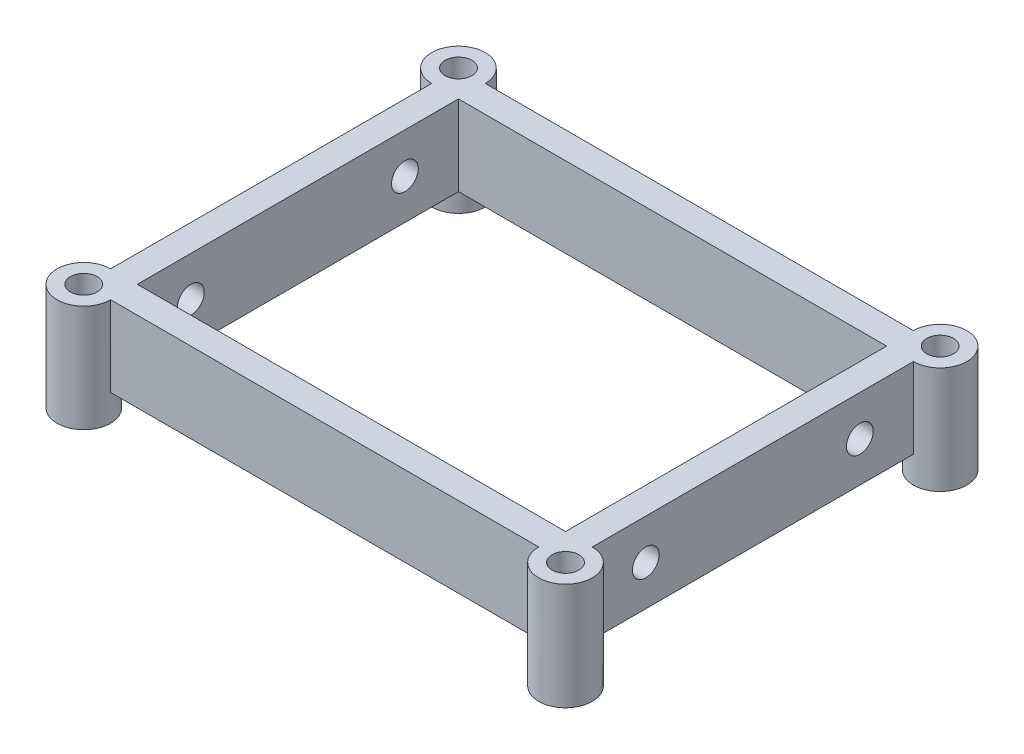
ISO-10303-21;
HEADER;
FILE_DESCRIPTION(('STEP AP214'),'2;1');
FILE_NAME('part.step','',(''),(''),'','','');
FILE_SCHEMA(('AUTOMOTIVE_DESIGN { 1 0 10303 214 1 1 1 1 }'));
ENDSEC;
DATA;
#1=APPLICATION_CONTEXT('core data for automotive mechanical design processes');
#2=APPLICATION_PROTOCOL_DEFINITION('international standard','automotive_design',2000,#1);
#3=PRODUCT_CONTEXT('',#1,'mechanical');
#4=PRODUCT('Part','Part','',(#3));
#5=PRODUCT_RELATED_PRODUCT_CATEGORY('part','',(#4));
#6=PRODUCT_DEFINITION_FORMATION('','',#4);
#7=PRODUCT_DEFINITION_CONTEXT('part definition',#1,'design');
#8=PRODUCT_DEFINITION('design','',#6,#7);
#9=PRODUCT_DEFINITION_SHAPE('','',#8);
#10=(LENGTH_UNIT() NAMED_UNIT(*) SI_UNIT(.MILLI.,.METRE.));
#11=(NAMED_UNIT(*) PLANE_ANGLE_UNIT() SI_UNIT($,.RADIAN.));
#12=(NAMED_UNIT(*) SI_UNIT($,.STERADIAN.) SOLID_ANGLE_UNIT());
#13=UNCERTAINTY_MEASURE_WITH_UNIT(LENGTH_MEASURE(1.E-05),#10,'distance_accuracy_value','');
#14=(GEOMETRIC_REPRESENTATION_CONTEXT(3) GLOBAL_UNCERTAINTY_ASSIGNED_CONTEXT((#13)) GLOBAL_UNIT_ASSIGNED_CONTEXT((#10,
#11,#12)) REPRESENTATION_CONTEXT('',''));
#15=CARTESIAN_POINT('',(0.,0.,0.));
#16=DIRECTION('',(0.,0.,1.));
#17=DIRECTION('',(1.,0.,0.));
#18=AXIS2_PLACEMENT_3D('',#15,#16,#17);
#19=CARTESIAN_POINT('',(0.,0.,0.));
#20=DIRECTION('',(0.,1.,0.));
#21=DIRECTION('',(0.,0.,1.));
#22=AXIS2_PLACEMENT_3D('',#19,#20,#21);
#23=PLANE('',#22);
#24=DIRECTION('',(0.,0.,1.));
#25=VECTOR('',#24,1.);
#26=CARTESIAN_POINT('',(0.,0.,-30.));
#27=LINE('',#26,#25);
#28=CARTESIAN_POINT('',(0.,0.,-30.));
#29=VERTEX_POINT('',#28);
#30=CARTESIAN_POINT('',(0.,0.,30.));
#31=VERTEX_POINT('',#30);
#32=EDGE_CURVE('E210',#29,#31,#27,.T.);
#33=ORIENTED_EDGE('',*,*,#32,.T.);
#34=DIRECTION('',(1.,0.,0.));
#35=VECTOR('',#34,1.);
#36=CARTESIAN_POINT('',(0.,0.,30.));
#37=LINE('',#36,#35);
#38=CARTESIAN_POINT('',(80.,0.,30.));
#39=VERTEX_POINT('',#38);
#40=EDGE_CURVE('E207',#31,#39,#37,.T.);
#41=ORIENTED_EDGE('',*,*,#40,.T.);
#42=DIRECTION('',(0.,0.,-1.));
#43=VECTOR('',#42,1.);
#44=CARTESIAN_POINT('',(80.,0.,-30.));
#45=LINE('',#44,#43);
#46=CARTESIAN_POINT('',(80.,0.,-30.));
#47=VERTEX_POINT('',#46);
#48=EDGE_CURVE('E204',#39,#47,#45,.T.);
#49=ORIENTED_EDGE('',*,*,#48,.T.);
#50=DIRECTION('',(-1.,0.,0.));
#51=VECTOR('',#50,1.);
#52=CARTESIAN_POINT('',(0.,0.,-30.));
#53=LINE('',#52,#51);
#54=EDGE_CURVE('E200',#47,#29,#53,.T.);
#55=ORIENTED_EDGE('',*,*,#54,.T.);
#56=EDGE_LOOP('',(#33,#41,#49,#55));
#57=FACE_BOUND('',#56,.T.);
#58=CARTESIAN_POINT('',(-4.99999999999992,0.,-35.0000000000001));
#59=DIRECTION('',(0.,-1.,0.));
#60=DIRECTION('',(0.,0.,1.));
#61=AXIS2_PLACEMENT_3D('',#58,#59,#60);
#62=CIRCLE('',#61,5.);
#63=CARTESIAN_POINT('',(0.,0.,-35.));
#64=VERTEX_POINT('',#63);
#65=CARTESIAN_POINT('',(-5.,0.,-30.));
#66=VERTEX_POINT('',#65);
#67=EDGE_CURVE('E126',#64,#66,#62,.T.);
#68=ORIENTED_EDGE('',*,*,#67,.F.);
#69=DIRECTION('',(-1.,0.,0.));
#70=VECTOR('',#69,1.);
#71=CARTESIAN_POINT('',(-5.,0.,-35.));
#72=LINE('',#71,#70);
#73=CARTESIAN_POINT('',(80.,0.,-35.));
#74=VERTEX_POINT('',#73);
#75=EDGE_CURVE('E129',#74,#64,#72,.T.);
#76=ORIENTED_EDGE('',*,*,#75,.F.);
#77=CARTESIAN_POINT('',(85.,0.,-35.));
#78=DIRECTION('',(0.,-1.,0.));
#79=DIRECTION('',(0.,0.,-1.));
#80=AXIS2_PLACEMENT_3D('',#77,#78,#79);
#81=CIRCLE('',#80,5.);
#82=CARTESIAN_POINT('',(85.,0.,-30.));
#83=VERTEX_POINT('',#82);
#84=EDGE_CURVE('E263',#83,#74,#81,.T.);
#85=ORIENTED_EDGE('',*,*,#84,.F.);
#86=DIRECTION('',(0.,0.,-1.));
#87=VECTOR('',#86,1.);
#88=CARTESIAN_POINT('',(85.,0.,-35.));
#89=LINE('',#88,#87);
#90=CARTESIAN_POINT('',(85.,0.,30.));
#91=VERTEX_POINT('',#90);
#92=EDGE_CURVE('E149',#91,#83,#89,.T.);
#93=ORIENTED_EDGE('',*,*,#92,.F.);
#94=CARTESIAN_POINT('',(85.,0.,35.));
#95=DIRECTION('',(0.,-1.,0.));
#96=DIRECTION('',(0.,0.,-1.));
#97=AXIS2_PLACEMENT_3D('',#94,#95,#96);
#98=CIRCLE('',#97,5.00000000000001);
#99=CARTESIAN_POINT('',(80.,0.,35.));
#100=VERTEX_POINT('',#99);
#101=EDGE_CURVE('E182',#100,#91,#98,.T.);
#102=ORIENTED_EDGE('',*,*,#101,.F.);
#103=DIRECTION('',(1.,0.,0.));
#104=VECTOR('',#103,1.);
#105=CARTESIAN_POINT('',(-4.99999999999999,0.,35.));
#106=LINE('',#105,#104);
#107=CARTESIAN_POINT('',(0.,0.,35.));
#108=VERTEX_POINT('',#107);
#109=EDGE_CURVE('E154',#108,#100,#106,.T.);
#110=ORIENTED_EDGE('',*,*,#109,.F.);
#111=CARTESIAN_POINT('',(-5.00000000000003,0.,35.));
#112=DIRECTION('',(0.,-1.,0.));
#113=DIRECTION('',(0.,0.,1.));
#114=AXIS2_PLACEMENT_3D('',#111,#112,#113);
#115=CIRCLE('',#114,5.);
#116=CARTESIAN_POINT('',(-4.99999999999999,0.,29.9999999999999));
#117=VERTEX_POINT('',#116);
#118=EDGE_CURVE('E180',#117,#108,#115,.T.);
#119=ORIENTED_EDGE('',*,*,#118,.F.);
#120=DIRECTION('',(0.,0.,1.));
#121=VECTOR('',#120,1.);
#122=CARTESIAN_POINT('',(-5.,0.,-35.));
#123=LINE('',#122,#121);
#124=EDGE_CURVE('E131',#66,#117,#123,.T.);
#125=ORIENTED_EDGE('',*,*,#124,.F.);
#126=EDGE_LOOP('',(#68,#76,#85,#93,#102,#110,#119,#125));
#127=FACE_BOUND('',#126,.T.);
#128=ADVANCED_FACE('F38',(#57,#127),#23,.F.);
#129=CARTESIAN_POINT('',(0.,15.,0.));
#130=DIRECTION('',(0.,1.,0.));
#131=DIRECTION('',(0.,0.,1.));
#132=AXIS2_PLACEMENT_3D('',#129,#130,#131);
#133=PLANE('',#132);
#134=CARTESIAN_POINT('',(85.,15.,35.));
#135=DIRECTION('',(0.,1.,0.));
#136=DIRECTION('',(0.,0.,1.));
#137=AXIS2_PLACEMENT_3D('',#134,#135,#136);
#138=CIRCLE('',#137,2.5);
#139=CARTESIAN_POINT('',(85.,15.,37.5));
#140=VERTEX_POINT('',#139);
#141=EDGE_CURVE('E254',#140,#140,#138,.T.);
#142=ORIENTED_EDGE('',*,*,#141,.F.);
#143=EDGE_LOOP('',(#142));
#144=FACE_BOUND('',#143,.T.);
#145=CARTESIAN_POINT('',(85.,15.,-35.));
#146=DIRECTION('',(0.,1.,0.));
#147=DIRECTION('',(0.,0.,1.));
#148=AXIS2_PLACEMENT_3D('',#145,#146,#147);
#149=CIRCLE('',#148,2.5);
#150=CARTESIAN_POINT('',(85.,15.,-32.5));
#151=VERTEX_POINT('',#150);
#152=EDGE_CURVE('E257',#151,#151,#149,.T.);
#153=ORIENTED_EDGE('',*,*,#152,.F.);
#154=EDGE_LOOP('',(#153));
#155=FACE_BOUND('',#154,.T.);
#156=CARTESIAN_POINT('',(-4.99999999999999,15.,-35.));
#157=DIRECTION('',(0.,1.,0.));
#158=DIRECTION('',(0.,0.,1.));
#159=AXIS2_PLACEMENT_3D('',#156,#157,#158);
#160=CIRCLE('',#159,2.5);
#161=CARTESIAN_POINT('',(-4.99999999999999,15.,-32.5));
#162=VERTEX_POINT('',#161);
#163=EDGE_CURVE('E253',#162,#162,#160,.T.);
#164=ORIENTED_EDGE('',*,*,#163,.F.);
#165=EDGE_LOOP('',(#164));
#166=FACE_BOUND('',#165,.T.);
#167=CARTESIAN_POINT('',(-4.99999999999999,15.,35.));
#168=DIRECTION('',(0.,1.,0.));
#169=DIRECTION('',(0.,0.,1.));
#170=AXIS2_PLACEMENT_3D('',#167,#168,#169);
#171=CIRCLE('',#170,2.5);
#172=CARTESIAN_POINT('',(-4.99999999999999,15.,37.5));
#173=VERTEX_POINT('',#172);
#174=EDGE_CURVE('E250',#173,#173,#171,.T.);
#175=ORIENTED_EDGE('',*,*,#174,.F.);
#176=EDGE_LOOP('',(#175));
#177=FACE_BOUND('',#176,.T.);
#178=DIRECTION('',(-1.,0.,0.));
#179=VECTOR('',#178,1.);
#180=CARTESIAN_POINT('',(-5.,15.,-35.));
#181=LINE('',#180,#179);
#182=CARTESIAN_POINT('',(80.,15.,-35.));
#183=VERTEX_POINT('',#182);
#184=CARTESIAN_POINT('',(0.,15.,-35.));
#185=VERTEX_POINT('',#184);
#186=EDGE_CURVE('E169',#183,#185,#181,.T.);
#187=ORIENTED_EDGE('',*,*,#186,.T.);
#188=CARTESIAN_POINT('',(-4.99999999999999,15.,-35.));
#189=DIRECTION('',(0.,1.,0.));
#190=DIRECTION('',(0.,0.,-1.));
#191=AXIS2_PLACEMENT_3D('',#188,#189,#190);
#192=CIRCLE('',#191,5.);
#193=CARTESIAN_POINT('',(-5.,15.,-30.));
#194=VERTEX_POINT('',#193);
#195=EDGE_CURVE('E140',#185,#194,#192,.T.);
#196=ORIENTED_EDGE('',*,*,#195,.T.);
#197=DIRECTION('',(0.,0.,1.));
#198=VECTOR('',#197,1.);
#199=CARTESIAN_POINT('',(-5.,15.,-35.));
#200=LINE('',#199,#198);
#201=CARTESIAN_POINT('',(-4.99999999999999,15.,30.));
#202=VERTEX_POINT('',#201);
#203=EDGE_CURVE('E148',#194,#202,#200,.T.);
#204=ORIENTED_EDGE('',*,*,#203,.T.);
#205=CARTESIAN_POINT('',(-4.99999999999999,15.,35.));
#206=DIRECTION('',(0.,1.,0.));
#207=DIRECTION('',(0.,0.,1.));
#208=AXIS2_PLACEMENT_3D('',#205,#206,#207);
#209=CIRCLE('',#208,5.);
#210=CARTESIAN_POINT('',(0.,15.,35.));
#211=VERTEX_POINT('',#210);
#212=EDGE_CURVE('E53',#202,#211,#209,.T.);
#213=ORIENTED_EDGE('',*,*,#212,.T.);
#214=DIRECTION('',(1.,0.,0.));
#215=VECTOR('',#214,1.);
#216=CARTESIAN_POINT('',(-4.99999999999999,15.,35.));
#217=LINE('',#216,#215);
#218=CARTESIAN_POINT('',(80.,15.,35.));
#219=VERTEX_POINT('',#218);
#220=EDGE_CURVE('E151',#211,#219,#217,.T.);
#221=ORIENTED_EDGE('',*,*,#220,.T.);
#222=CARTESIAN_POINT('',(85.,15.,35.));
#223=DIRECTION('',(0.,1.,0.));
#224=DIRECTION('',(0.,0.,-1.));
#225=AXIS2_PLACEMENT_3D('',#222,#223,#224);
#226=CIRCLE('',#225,5.00000000000001);
#227=CARTESIAN_POINT('',(85.,15.,30.));
#228=VERTEX_POINT('',#227);
#229=EDGE_CURVE('E59',#219,#228,#226,.T.);
#230=ORIENTED_EDGE('',*,*,#229,.T.);
#231=DIRECTION('',(0.,0.,-1.));
#232=VECTOR('',#231,1.);
#233=CARTESIAN_POINT('',(85.,15.,-35.));
#234=LINE('',#233,#232);
#235=CARTESIAN_POINT('',(85.,15.,-30.));
#236=VERTEX_POINT('',#235);
#237=EDGE_CURVE('E187',#228,#236,#234,.T.);
#238=ORIENTED_EDGE('',*,*,#237,.T.);
#239=CARTESIAN_POINT('',(85.,15.,-35.));
#240=DIRECTION('',(0.,1.,0.));
#241=DIRECTION('',(0.,0.,1.));
#242=AXIS2_PLACEMENT_3D('',#239,#240,#241);
#243=CIRCLE('',#242,5.00000000000001);
#244=EDGE_CURVE('E238',#236,#183,#243,.T.);
#245=ORIENTED_EDGE('',*,*,#244,.T.);
#246=EDGE_LOOP('',(#187,#196,#204,#213,#221,#230,#238,#245));
#247=FACE_BOUND('',#246,.T.);
#248=DIRECTION('',(1.,0.,0.));
#249=VECTOR('',#248,1.);
#250=CARTESIAN_POINT('',(0.,15.,30.));
#251=LINE('',#250,#249);
#252=CARTESIAN_POINT('',(0.,15.,30.));
#253=VERTEX_POINT('',#252);
#254=CARTESIAN_POINT('',(80.,15.,30.));
#255=VERTEX_POINT('',#254);
#256=EDGE_CURVE('E217',#253,#255,#251,.T.);
#257=ORIENTED_EDGE('',*,*,#256,.F.);
#258=DIRECTION('',(0.,0.,1.));
#259=VECTOR('',#258,1.);
#260=CARTESIAN_POINT('',(0.,15.,-30.));
#261=LINE('',#260,#259);
#262=CARTESIAN_POINT('',(0.,15.,-30.));
#263=VERTEX_POINT('',#262);
#264=EDGE_CURVE('E203',#263,#253,#261,.T.);
#265=ORIENTED_EDGE('',*,*,#264,.F.);
#266=DIRECTION('',(-1.,0.,0.));
#267=VECTOR('',#266,1.);
#268=CARTESIAN_POINT('',(0.,15.,-30.));
#269=LINE('',#268,#267);
#270=CARTESIAN_POINT('',(80.,15.,-30.));
#271=VERTEX_POINT('',#270);
#272=EDGE_CURVE('E199',#271,#263,#269,.T.);
#273=ORIENTED_EDGE('',*,*,#272,.F.);
#274=DIRECTION('',(0.,0.,-1.));
#275=VECTOR('',#274,1.);
#276=CARTESIAN_POINT('',(80.,15.,-30.));
#277=LINE('',#276,#275);
#278=EDGE_CURVE('E214',#255,#271,#277,.T.);
#279=ORIENTED_EDGE('',*,*,#278,.F.);
#280=EDGE_LOOP('',(#257,#265,#273,#279));
#281=FACE_BOUND('',#280,.T.);
#282=ADVANCED_FACE('F303',(#144,#155,#166,#177,#247,#281),#133,.T.);
#283=CARTESIAN_POINT('',(-5.,15.,-35.));
#284=DIRECTION('',(1.,0.,0.));
#285=DIRECTION('',(0.,0.,-1.));
#286=AXIS2_PLACEMENT_3D('',#283,#284,#285);
#287=PLANE('',#286);
#288=CARTESIAN_POINT('',(-5.00000000000002,7.5,-20.));
#289=DIRECTION('',(1.,0.,0.));
#290=DIRECTION('',(0.,0.,-1.));
#291=AXIS2_PLACEMENT_3D('',#288,#289,#290);
#292=CIRCLE('',#291,2.5);
#293=CARTESIAN_POINT('',(-5.00000000000002,7.5,-22.5));
#294=VERTEX_POINT('',#293);
#295=EDGE_CURVE('E162',#294,#294,#292,.T.);
#296=ORIENTED_EDGE('',*,*,#295,.T.);
#297=EDGE_LOOP('',(#296));
#298=FACE_BOUND('',#297,.T.);
#299=CARTESIAN_POINT('',(-5.00000000000002,7.5,20.));
#300=DIRECTION('',(1.,0.,0.));
#301=DIRECTION('',(0.,0.,1.));
#302=AXIS2_PLACEMENT_3D('',#299,#300,#301);
#303=CIRCLE('',#302,2.5);
#304=CARTESIAN_POINT('',(-5.00000000000002,7.5,22.5));
#305=VERTEX_POINT('',#304);
#306=EDGE_CURVE('E227',#305,#305,#303,.T.);
#307=ORIENTED_EDGE('',*,*,#306,.T.);
#308=EDGE_LOOP('',(#307));
#309=FACE_BOUND('',#308,.T.);
#310=ORIENTED_EDGE('',*,*,#203,.F.);
#311=DIRECTION('',(0.,1.,0.));
#312=VECTOR('',#311,1.);
#313=CARTESIAN_POINT('',(-5.,0.,-30.));
#314=LINE('',#313,#312);
#315=EDGE_CURVE('E247',#194,#66,#314,.F.);
#316=ORIENTED_EDGE('',*,*,#315,.T.);
#317=ORIENTED_EDGE('',*,*,#124,.T.);
#318=DIRECTION('',(0.,1.,0.));
#319=VECTOR('',#318,1.);
#320=CARTESIAN_POINT('',(-4.99999999999999,0.,30.));
#321=LINE('',#320,#319);
#322=EDGE_CURVE('E243',#117,#202,#321,.T.);
#323=ORIENTED_EDGE('',*,*,#322,.T.);
#324=EDGE_LOOP('',(#310,#316,#317,#323));
#325=FACE_BOUND('',#324,.T.);
#326=ADVANCED_FACE('F40',(#298,#309,#325),#287,.F.);
#327=CARTESIAN_POINT('',(-4.99999999999999,15.,35.));
#328=DIRECTION('',(0.,0.,-1.));
#329=DIRECTION('',(-1.,0.,0.));
#330=AXIS2_PLACEMENT_3D('',#327,#328,#329);
#331=PLANE('',#330);
#332=ORIENTED_EDGE('',*,*,#220,.F.);
#333=DIRECTION('',(0.,1.,0.));
#334=VECTOR('',#333,1.);
#335=CARTESIAN_POINT('',(0.,0.,35.));
#336=LINE('',#335,#334);
#337=EDGE_CURVE('E46',#211,#108,#336,.F.);
#338=ORIENTED_EDGE('',*,*,#337,.T.);
#339=ORIENTED_EDGE('',*,*,#109,.T.);
#340=DIRECTION('',(0.,1.,0.));
#341=VECTOR('',#340,1.);
#342=CARTESIAN_POINT('',(80.,0.,35.));
#343=LINE('',#342,#341);
#344=EDGE_CURVE('E240',#100,#219,#343,.T.);
#345=ORIENTED_EDGE('',*,*,#344,.T.);
#346=EDGE_LOOP('',(#332,#338,#339,#345));
#347=FACE_BOUND('',#346,.T.);
#348=ADVANCED_FACE('F176',(#347),#331,.F.);
#349=CARTESIAN_POINT('',(85.,15.,-35.));
#350=DIRECTION('',(-1.,0.,0.));
#351=DIRECTION('',(0.,0.,1.));
#352=AXIS2_PLACEMENT_3D('',#349,#350,#351);
#353=PLANE('',#352);
#354=CARTESIAN_POINT('',(85.,7.5,-20.));
#355=DIRECTION('',(1.,0.,0.));
#356=DIRECTION('',(0.,0.,-1.));
#357=AXIS2_PLACEMENT_3D('',#354,#355,#356);
#358=CIRCLE('',#357,2.5);
#359=CARTESIAN_POINT('',(85.,7.5,-22.5));
#360=VERTEX_POINT('',#359);
#361=EDGE_CURVE('E231',#360,#360,#358,.T.);
#362=ORIENTED_EDGE('',*,*,#361,.F.);
#363=EDGE_LOOP('',(#362));
#364=FACE_BOUND('',#363,.T.);
#365=CARTESIAN_POINT('',(85.,7.5,20.));
#366=DIRECTION('',(1.,0.,0.));
#367=DIRECTION('',(0.,0.,1.));
#368=AXIS2_PLACEMENT_3D('',#365,#366,#367);
#369=CIRCLE('',#368,2.5);
#370=CARTESIAN_POINT('',(85.,7.5,22.5));
#371=VERTEX_POINT('',#370);
#372=EDGE_CURVE('E224',#371,#371,#369,.T.);
#373=ORIENTED_EDGE('',*,*,#372,.F.);
#374=EDGE_LOOP('',(#373));
#375=FACE_BOUND('',#374,.T.);
#376=ORIENTED_EDGE('',*,*,#237,.F.);
#377=DIRECTION('',(0.,1.,0.));
#378=VECTOR('',#377,1.);
#379=CARTESIAN_POINT('',(85.,0.,30.));
#380=LINE('',#379,#378);
#381=EDGE_CURVE('E168',#228,#91,#380,.F.);
#382=ORIENTED_EDGE('',*,*,#381,.T.);
#383=ORIENTED_EDGE('',*,*,#92,.T.);
#384=DIRECTION('',(0.,1.,0.));
#385=VECTOR('',#384,1.);
#386=CARTESIAN_POINT('',(85.,0.,-30.));
#387=LINE('',#386,#385);
#388=EDGE_CURVE('E228',#83,#236,#387,.T.);
#389=ORIENTED_EDGE('',*,*,#388,.T.);
#390=EDGE_LOOP('',(#376,#382,#383,#389));
#391=FACE_BOUND('',#390,.T.);
#392=ADVANCED_FACE('F316',(#364,#375,#391),#353,.F.);
#393=CARTESIAN_POINT('',(-5.,15.,-35.));
#394=DIRECTION('',(0.,0.,1.));
#395=DIRECTION('',(1.,0.,0.));
#396=AXIS2_PLACEMENT_3D('',#393,#394,#395);
#397=PLANE('',#396);
#398=ORIENTED_EDGE('',*,*,#75,.T.);
#399=DIRECTION('',(0.,1.,0.));
#400=VECTOR('',#399,1.);
#401=CARTESIAN_POINT('',(0.,0.,-35.));
#402=LINE('',#401,#400);
#403=EDGE_CURVE('E11',#64,#185,#402,.T.);
#404=ORIENTED_EDGE('',*,*,#403,.T.);
#405=ORIENTED_EDGE('',*,*,#186,.F.);
#406=DIRECTION('',(0.,1.,0.));
#407=VECTOR('',#406,1.);
#408=CARTESIAN_POINT('',(80.,0.,-35.));
#409=LINE('',#408,#407);
#410=EDGE_CURVE('E147',#183,#74,#409,.F.);
#411=ORIENTED_EDGE('',*,*,#410,.T.);
#412=EDGE_LOOP('',(#398,#404,#405,#411));
#413=FACE_BOUND('',#412,.T.);
#414=ADVANCED_FACE('F145',(#413),#397,.F.);
#415=CARTESIAN_POINT('',(0.,15.,-30.));
#416=DIRECTION('',(1.,0.,0.));
#417=DIRECTION('',(0.,0.,-1.));
#418=AXIS2_PLACEMENT_3D('',#415,#416,#417);
#419=PLANE('',#418);
#420=CARTESIAN_POINT('',(0.,7.5,-20.));
#421=DIRECTION('',(1.,0.,0.));
#422=DIRECTION('',(0.,0.,-1.));
#423=AXIS2_PLACEMENT_3D('',#420,#421,#422);
#424=CIRCLE('',#423,2.5);
#425=CARTESIAN_POINT('',(0.,7.5,-22.5));
#426=VERTEX_POINT('',#425);
#427=EDGE_CURVE('E166',#426,#426,#424,.T.);
#428=ORIENTED_EDGE('',*,*,#427,.F.);
#429=EDGE_LOOP('',(#428));
#430=FACE_BOUND('',#429,.T.);
#431=CARTESIAN_POINT('',(0.,7.5,20.));
#432=DIRECTION('',(1.,0.,0.));
#433=DIRECTION('',(0.,0.,-1.));
#434=AXIS2_PLACEMENT_3D('',#431,#432,#433);
#435=CIRCLE('',#434,2.5);
#436=CARTESIAN_POINT('',(0.,7.5,17.5));
#437=VERTEX_POINT('',#436);
#438=EDGE_CURVE('E161',#437,#437,#435,.T.);
#439=ORIENTED_EDGE('',*,*,#438,.F.);
#440=EDGE_LOOP('',(#439));
#441=FACE_BOUND('',#440,.T.);
#442=ORIENTED_EDGE('',*,*,#32,.F.);
#443=DIRECTION('',(0.,-1.,0.));
#444=VECTOR('',#443,1.);
#445=CARTESIAN_POINT('',(0.,15.,-30.));
#446=LINE('',#445,#444);
#447=EDGE_CURVE('E196',#263,#29,#446,.T.);
#448=ORIENTED_EDGE('',*,*,#447,.F.);
#449=ORIENTED_EDGE('',*,*,#264,.T.);
#450=DIRECTION('',(0.,-1.,0.));
#451=VECTOR('',#450,1.);
#452=CARTESIAN_POINT('',(0.,15.,30.));
#453=LINE('',#452,#451);
#454=EDGE_CURVE('E183',#253,#31,#453,.T.);
#455=ORIENTED_EDGE('',*,*,#454,.T.);
#456=EDGE_LOOP('',(#442,#448,#449,#455));
#457=FACE_BOUND('',#456,.T.);
#458=ADVANCED_FACE('F315',(#430,#441,#457),#419,.T.);
#459=CARTESIAN_POINT('',(0.,15.,30.));
#460=DIRECTION('',(0.,0.,-1.));
#461=DIRECTION('',(-1.,0.,0.));
#462=AXIS2_PLACEMENT_3D('',#459,#460,#461);
#463=PLANE('',#462);
#464=ORIENTED_EDGE('',*,*,#40,.F.);
#465=ORIENTED_EDGE('',*,*,#454,.F.);
#466=ORIENTED_EDGE('',*,*,#256,.T.);
#467=DIRECTION('',(0.,-1.,0.));
#468=VECTOR('',#467,1.);
#469=CARTESIAN_POINT('',(80.,15.,30.));
#470=LINE('',#469,#468);
#471=EDGE_CURVE('E192',#255,#39,#470,.T.);
#472=ORIENTED_EDGE('',*,*,#471,.T.);
#473=EDGE_LOOP('',(#464,#465,#466,#472));
#474=FACE_BOUND('',#473,.T.);
#475=ADVANCED_FACE('F382',(#474),#463,.T.);
#476=CARTESIAN_POINT('',(80.,15.,-30.));
#477=DIRECTION('',(-1.,0.,0.));
#478=DIRECTION('',(0.,0.,1.));
#479=AXIS2_PLACEMENT_3D('',#476,#477,#478);
#480=PLANE('',#479);
#481=CARTESIAN_POINT('',(80.,7.5,-20.));
#482=DIRECTION('',(-1.,0.,0.));
#483=DIRECTION('',(0.,0.,1.));
#484=AXIS2_PLACEMENT_3D('',#481,#482,#483);
#485=CIRCLE('',#484,2.5);
#486=CARTESIAN_POINT('',(80.,7.5,-17.5));
#487=VERTEX_POINT('',#486);
#488=EDGE_CURVE('E163',#487,#487,#485,.T.);
#489=ORIENTED_EDGE('',*,*,#488,.F.);
#490=EDGE_LOOP('',(#489));
#491=FACE_BOUND('',#490,.T.);
#492=CARTESIAN_POINT('',(80.,7.5,20.));
#493=DIRECTION('',(-1.,0.,0.));
#494=DIRECTION('',(0.,0.,1.));
#495=AXIS2_PLACEMENT_3D('',#492,#493,#494);
#496=CIRCLE('',#495,2.5);
#497=CARTESIAN_POINT('',(80.,7.5,22.5));
#498=VERTEX_POINT('',#497);
#499=EDGE_CURVE('E158',#498,#498,#496,.T.);
#500=ORIENTED_EDGE('',*,*,#499,.F.);
#501=EDGE_LOOP('',(#500));
#502=FACE_BOUND('',#501,.T.);
#503=ORIENTED_EDGE('',*,*,#48,.F.);
#504=ORIENTED_EDGE('',*,*,#471,.F.);
#505=ORIENTED_EDGE('',*,*,#278,.T.);
#506=DIRECTION('',(0.,-1.,0.));
#507=VECTOR('',#506,1.);
#508=CARTESIAN_POINT('',(80.,15.,-30.));
#509=LINE('',#508,#507);
#510=EDGE_CURVE('E194',#271,#47,#509,.T.);
#511=ORIENTED_EDGE('',*,*,#510,.T.);
#512=EDGE_LOOP('',(#503,#504,#505,#511));
#513=FACE_BOUND('',#512,.T.);
#514=ADVANCED_FACE('F378',(#491,#502,#513),#480,.T.);
#515=CARTESIAN_POINT('',(0.,15.,-30.));
#516=DIRECTION('',(0.,0.,1.));
#517=DIRECTION('',(1.,0.,0.));
#518=AXIS2_PLACEMENT_3D('',#515,#516,#517);
#519=PLANE('',#518);
#520=ORIENTED_EDGE('',*,*,#54,.F.);
#521=ORIENTED_EDGE('',*,*,#510,.F.);
#522=ORIENTED_EDGE('',*,*,#272,.T.);
#523=ORIENTED_EDGE('',*,*,#447,.T.);
#524=EDGE_LOOP('',(#520,#521,#522,#523));
#525=FACE_BOUND('',#524,.T.);
#526=ADVANCED_FACE('F374',(#525),#519,.T.);
#527=CARTESIAN_POINT('',(-5.00000000000002,7.5,20.));
#528=DIRECTION('',(1.,0.,0.));
#529=DIRECTION('',(0.,0.,-1.));
#530=AXIS2_PLACEMENT_3D('',#527,#528,#529);
#531=CYLINDRICAL_SURFACE('',#530,2.5);
#532=ORIENTED_EDGE('',*,*,#499,.T.);
#533=EDGE_LOOP('',(#532));
#534=FACE_BOUND('',#533,.T.);
#535=ORIENTED_EDGE('',*,*,#372,.T.);
#536=EDGE_LOOP('',(#535));
#537=FACE_BOUND('',#536,.T.);
#538=ADVANCED_FACE('F370',(#534,#537),#531,.F.);
#539=CARTESIAN_POINT('',(-5.00000000000002,7.5,-20.));
#540=DIRECTION('',(1.,0.,0.));
#541=DIRECTION('',(0.,0.,-1.));
#542=AXIS2_PLACEMENT_3D('',#539,#540,#541);
#543=CYLINDRICAL_SURFACE('',#542,2.5);
#544=ORIENTED_EDGE('',*,*,#488,.T.);
#545=EDGE_LOOP('',(#544));
#546=FACE_BOUND('',#545,.T.);
#547=ORIENTED_EDGE('',*,*,#361,.T.);
#548=EDGE_LOOP('',(#547));
#549=FACE_BOUND('',#548,.T.);
#550=ADVANCED_FACE('F366',(#546,#549),#543,.F.);
#551=ORIENTED_EDGE('',*,*,#438,.T.);
#552=EDGE_LOOP('',(#551));
#553=FACE_BOUND('',#552,.T.);
#554=ORIENTED_EDGE('',*,*,#306,.F.);
#555=EDGE_LOOP('',(#554));
#556=FACE_BOUND('',#555,.T.);
#557=ADVANCED_FACE('F369',(#553,#556),#531,.F.);
#558=ORIENTED_EDGE('',*,*,#427,.T.);
#559=EDGE_LOOP('',(#558));
#560=FACE_BOUND('',#559,.T.);
#561=ORIENTED_EDGE('',*,*,#295,.F.);
#562=EDGE_LOOP('',(#561));
#563=FACE_BOUND('',#562,.T.);
#564=ADVANCED_FACE('F364',(#560,#563),#543,.F.);
#565=CARTESIAN_POINT('',(85.,0.,-35.));
#566=DIRECTION('',(0.,1.,0.));
#567=DIRECTION('',(0.,0.,1.));
#568=AXIS2_PLACEMENT_3D('',#565,#566,#567);
#569=CYLINDRICAL_SURFACE('',#568,5.00000000000001);
#570=ORIENTED_EDGE('',*,*,#388,.F.);
#571=ORIENTED_EDGE('',*,*,#84,.T.);
#572=ORIENTED_EDGE('',*,*,#410,.F.);
#573=ORIENTED_EDGE('',*,*,#244,.F.);
#574=EDGE_LOOP('',(#570,#571,#572,#573));
#575=FACE_BOUND('',#574,.T.);
#576=CARTESIAN_POINT('',(85.,-5.,-35.));
#577=DIRECTION('',(0.,-1.,0.));
#578=DIRECTION('',(0.,0.,-1.));
#579=AXIS2_PLACEMENT_3D('',#576,#577,#578);
#580=CIRCLE('',#579,5.);
#581=CARTESIAN_POINT('',(85.,-5.,-40.));
#582=VERTEX_POINT('',#581);
#583=EDGE_CURVE('E258',#582,#582,#580,.T.);
#584=ORIENTED_EDGE('',*,*,#583,.F.);
#585=EDGE_LOOP('',(#584));
#586=FACE_BOUND('',#585,.T.);
#587=ADVANCED_FACE('F360',(#575,#586),#569,.T.);
#588=CARTESIAN_POINT('',(85.,0.,35.));
#589=DIRECTION('',(0.,1.,0.));
#590=DIRECTION('',(0.,0.,1.));
#591=AXIS2_PLACEMENT_3D('',#588,#589,#590);
#592=CYLINDRICAL_SURFACE('',#591,5.00000000000001);
#593=ORIENTED_EDGE('',*,*,#344,.F.);
#594=ORIENTED_EDGE('',*,*,#101,.T.);
#595=ORIENTED_EDGE('',*,*,#381,.F.);
#596=ORIENTED_EDGE('',*,*,#229,.F.);
#597=EDGE_LOOP('',(#593,#594,#595,#596));
#598=FACE_BOUND('',#597,.T.);
#599=CARTESIAN_POINT('',(85.,-5.,35.));
#600=DIRECTION('',(0.,-1.,0.));
#601=DIRECTION('',(0.,0.,-1.));
#602=AXIS2_PLACEMENT_3D('',#599,#600,#601);
#603=CIRCLE('',#602,5.00000000000001);
#604=CARTESIAN_POINT('',(85.,-5.,30.));
#605=VERTEX_POINT('',#604);
#606=EDGE_CURVE('E270',#605,#605,#603,.T.);
#607=ORIENTED_EDGE('',*,*,#606,.F.);
#608=EDGE_LOOP('',(#607));
#609=FACE_BOUND('',#608,.T.);
#610=ADVANCED_FACE('F336',(#598,#609),#592,.T.);
#611=CARTESIAN_POINT('',(-4.99999999999999,0.,35.));
#612=DIRECTION('',(0.,1.,0.));
#613=DIRECTION('',(0.,0.,1.));
#614=AXIS2_PLACEMENT_3D('',#611,#612,#613);
#615=CYLINDRICAL_SURFACE('',#614,5.);
#616=ORIENTED_EDGE('',*,*,#322,.F.);
#617=ORIENTED_EDGE('',*,*,#118,.T.);
#618=ORIENTED_EDGE('',*,*,#337,.F.);
#619=ORIENTED_EDGE('',*,*,#212,.F.);
#620=EDGE_LOOP('',(#616,#617,#618,#619));
#621=FACE_BOUND('',#620,.T.);
#622=CARTESIAN_POINT('',(-5.00000000000003,-5.,35.));
#623=DIRECTION('',(0.,-1.,0.));
#624=DIRECTION('',(0.,0.,1.));
#625=AXIS2_PLACEMENT_3D('',#622,#623,#624);
#626=CIRCLE('',#625,5.);
#627=CARTESIAN_POINT('',(-5.00000000000003,-5.,40.));
#628=VERTEX_POINT('',#627);
#629=EDGE_CURVE('E277',#628,#628,#626,.T.);
#630=ORIENTED_EDGE('',*,*,#629,.F.);
#631=EDGE_LOOP('',(#630));
#632=FACE_BOUND('',#631,.T.);
#633=ADVANCED_FACE('F333',(#621,#632),#615,.T.);
#634=CARTESIAN_POINT('',(-4.99999999999999,0.,-35.));
#635=DIRECTION('',(0.,1.,0.));
#636=DIRECTION('',(0.,0.,1.));
#637=AXIS2_PLACEMENT_3D('',#634,#635,#636);
#638=CYLINDRICAL_SURFACE('',#637,5.);
#639=ORIENTED_EDGE('',*,*,#315,.F.);
#640=ORIENTED_EDGE('',*,*,#195,.F.);
#641=ORIENTED_EDGE('',*,*,#403,.F.);
#642=ORIENTED_EDGE('',*,*,#67,.T.);
#643=EDGE_LOOP('',(#639,#640,#641,#642));
#644=FACE_BOUND('',#643,.T.);
#645=CARTESIAN_POINT('',(-4.99999999999992,-5.,-35.0000000000001));
#646=DIRECTION('',(0.,-1.,0.));
#647=DIRECTION('',(0.,0.,1.));
#648=AXIS2_PLACEMENT_3D('',#645,#646,#647);
#649=CIRCLE('',#648,5.);
#650=CARTESIAN_POINT('',(-4.99999999999992,-5.,-30.0000000000001));
#651=VERTEX_POINT('',#650);
#652=EDGE_CURVE('E134',#651,#651,#649,.T.);
#653=ORIENTED_EDGE('',*,*,#652,.F.);
#654=EDGE_LOOP('',(#653));
#655=FACE_BOUND('',#654,.T.);
#656=ADVANCED_FACE('F137',(#644,#655),#638,.T.);
#657=CARTESIAN_POINT('',(-4.99999999999999,0.,35.));
#658=DIRECTION('',(0.,1.,0.));
#659=DIRECTION('',(0.,0.,1.));
#660=AXIS2_PLACEMENT_3D('',#657,#658,#659);
#661=CYLINDRICAL_SURFACE('',#660,2.5);
#662=ORIENTED_EDGE('',*,*,#174,.T.);
#663=EDGE_LOOP('',(#662));
#664=FACE_BOUND('',#663,.T.);
#665=CARTESIAN_POINT('',(-5.00000000000003,-5.,35.));
#666=DIRECTION('',(0.,-1.,0.));
#667=DIRECTION('',(0.,0.,1.));
#668=AXIS2_PLACEMENT_3D('',#665,#666,#667);
#669=CIRCLE('',#668,2.49999999999999);
#670=CARTESIAN_POINT('',(-5.00000000000003,-5.,37.4999999999999));
#671=VERTEX_POINT('',#670);
#672=EDGE_CURVE('E279',#671,#671,#669,.T.);
#673=ORIENTED_EDGE('',*,*,#672,.T.);
#674=EDGE_LOOP('',(#673));
#675=FACE_BOUND('',#674,.T.);
#676=ADVANCED_FACE('F342',(#664,#675),#661,.F.);
#677=CARTESIAN_POINT('',(-4.99999999999999,0.,-35.));
#678=DIRECTION('',(0.,1.,0.));
#679=DIRECTION('',(0.,0.,1.));
#680=AXIS2_PLACEMENT_3D('',#677,#678,#679);
#681=CYLINDRICAL_SURFACE('',#680,2.5);
#682=ORIENTED_EDGE('',*,*,#163,.T.);
#683=EDGE_LOOP('',(#682));
#684=FACE_BOUND('',#683,.T.);
#685=CARTESIAN_POINT('',(-4.99999999999992,-5.,-35.0000000000001));
#686=DIRECTION('',(0.,-1.,0.));
#687=DIRECTION('',(0.,0.,1.));
#688=AXIS2_PLACEMENT_3D('',#685,#686,#687);
#689=CIRCLE('',#688,2.5);
#690=CARTESIAN_POINT('',(-4.99999999999992,-5.,-32.5000000000001));
#691=VERTEX_POINT('',#690);
#692=EDGE_CURVE('E135',#691,#691,#689,.T.);
#693=ORIENTED_EDGE('',*,*,#692,.T.);
#694=EDGE_LOOP('',(#693));
#695=FACE_BOUND('',#694,.T.);
#696=ADVANCED_FACE('F289',(#684,#695),#681,.F.);
#697=CARTESIAN_POINT('',(85.,0.,-35.));
#698=DIRECTION('',(0.,1.,0.));
#699=DIRECTION('',(0.,0.,1.));
#700=AXIS2_PLACEMENT_3D('',#697,#698,#699);
#701=CYLINDRICAL_SURFACE('',#700,2.5);
#702=ORIENTED_EDGE('',*,*,#152,.T.);
#703=EDGE_LOOP('',(#702));
#704=FACE_BOUND('',#703,.T.);
#705=CARTESIAN_POINT('',(85.,-5.,-35.));
#706=DIRECTION('',(0.,-1.,0.));
#707=DIRECTION('',(0.,0.,-1.));
#708=AXIS2_PLACEMENT_3D('',#705,#706,#707);
#709=CIRCLE('',#708,2.5);
#710=CARTESIAN_POINT('',(85.,-5.,-37.5));
#711=VERTEX_POINT('',#710);
#712=EDGE_CURVE('E265',#711,#711,#709,.T.);
#713=ORIENTED_EDGE('',*,*,#712,.T.);
#714=EDGE_LOOP('',(#713));
#715=FACE_BOUND('',#714,.T.);
#716=ADVANCED_FACE('F350',(#704,#715),#701,.F.);
#717=CARTESIAN_POINT('',(85.,0.,35.));
#718=DIRECTION('',(0.,1.,0.));
#719=DIRECTION('',(0.,0.,1.));
#720=AXIS2_PLACEMENT_3D('',#717,#718,#719);
#721=CYLINDRICAL_SURFACE('',#720,2.5);
#722=ORIENTED_EDGE('',*,*,#141,.T.);
#723=EDGE_LOOP('',(#722));
#724=FACE_BOUND('',#723,.T.);
#725=CARTESIAN_POINT('',(85.,-5.,35.));
#726=DIRECTION('',(0.,-1.,0.));
#727=DIRECTION('',(0.,0.,-1.));
#728=AXIS2_PLACEMENT_3D('',#725,#726,#727);
#729=CIRCLE('',#728,2.5);
#730=CARTESIAN_POINT('',(85.,-5.,32.5));
#731=VERTEX_POINT('',#730);
#732=EDGE_CURVE('E272',#731,#731,#729,.T.);
#733=ORIENTED_EDGE('',*,*,#732,.T.);
#734=EDGE_LOOP('',(#733));
#735=FACE_BOUND('',#734,.T.);
#736=ADVANCED_FACE('F355',(#724,#735),#721,.F.);
#737=CARTESIAN_POINT('',(85.,-5.,-35.));
#738=DIRECTION('',(0.,-1.,0.));
#739=DIRECTION('',(0.,0.,-1.));
#740=AXIS2_PLACEMENT_3D('',#737,#738,#739);
#741=PLANE('',#740);
#742=ORIENTED_EDGE('',*,*,#583,.T.);
#743=EDGE_LOOP('',(#742));
#744=FACE_BOUND('',#743,.T.);
#745=ORIENTED_EDGE('',*,*,#712,.F.);
#746=EDGE_LOOP('',(#745));
#747=FACE_BOUND('',#746,.T.);
#748=ADVANCED_FACE('F463',(#744,#747),#741,.T.);
#749=CARTESIAN_POINT('',(85.,-5.,35.));
#750=DIRECTION('',(0.,-1.,0.));
#751=DIRECTION('',(0.,0.,-1.));
#752=AXIS2_PLACEMENT_3D('',#749,#750,#751);
#753=PLANE('',#752);
#754=ORIENTED_EDGE('',*,*,#606,.T.);
#755=EDGE_LOOP('',(#754));
#756=FACE_BOUND('',#755,.T.);
#757=ORIENTED_EDGE('',*,*,#732,.F.);
#758=EDGE_LOOP('',(#757));
#759=FACE_BOUND('',#758,.T.);
#760=ADVANCED_FACE('F299',(#756,#759),#753,.T.);
#761=CARTESIAN_POINT('',(-5.00000000000003,-5.,35.));
#762=DIRECTION('',(0.,1.,0.));
#763=DIRECTION('',(0.,0.,1.));
#764=AXIS2_PLACEMENT_3D('',#761,#762,#763);
#765=PLANE('',#764);
#766=ORIENTED_EDGE('',*,*,#629,.T.);
#767=EDGE_LOOP('',(#766));
#768=FACE_BOUND('',#767,.T.);
#769=ORIENTED_EDGE('',*,*,#672,.F.);
#770=EDGE_LOOP('',(#769));
#771=FACE_BOUND('',#770,.T.);
#772=ADVANCED_FACE('F293',(#768,#771),#765,.F.);
#773=CARTESIAN_POINT('',(-4.99999999999992,-5.,-35.0000000000001));
#774=DIRECTION('',(0.,1.,0.));
#775=DIRECTION('',(0.,0.,1.));
#776=AXIS2_PLACEMENT_3D('',#773,#774,#775);
#777=PLANE('',#776);
#778=ORIENTED_EDGE('',*,*,#652,.T.);
#779=EDGE_LOOP('',(#778));
#780=FACE_BOUND('',#779,.T.);
#781=ORIENTED_EDGE('',*,*,#692,.F.);
#782=EDGE_LOOP('',(#781));
#783=FACE_BOUND('',#782,.T.);
#784=ADVANCED_FACE('F291',(#780,#783),#777,.F.);
#785=CLOSED_SHELL('',(#128,#282,#326,#348,#392,#414,#458,#475,#514,#526,#538,#550,#557,#564,
#587,#610,#633,#656,#676,#696,#716,#736,#748,#760,#772,#784));
#786=MANIFOLD_SOLID_BREP('B2',#785);
#787=ADVANCED_BREP_SHAPE_REPRESENTATION('',(#18,#786),#14);
#788=SHAPE_DEFINITION_REPRESENTATION(#9,#787);
ENDSEC;
END-ISO-10303-21;
